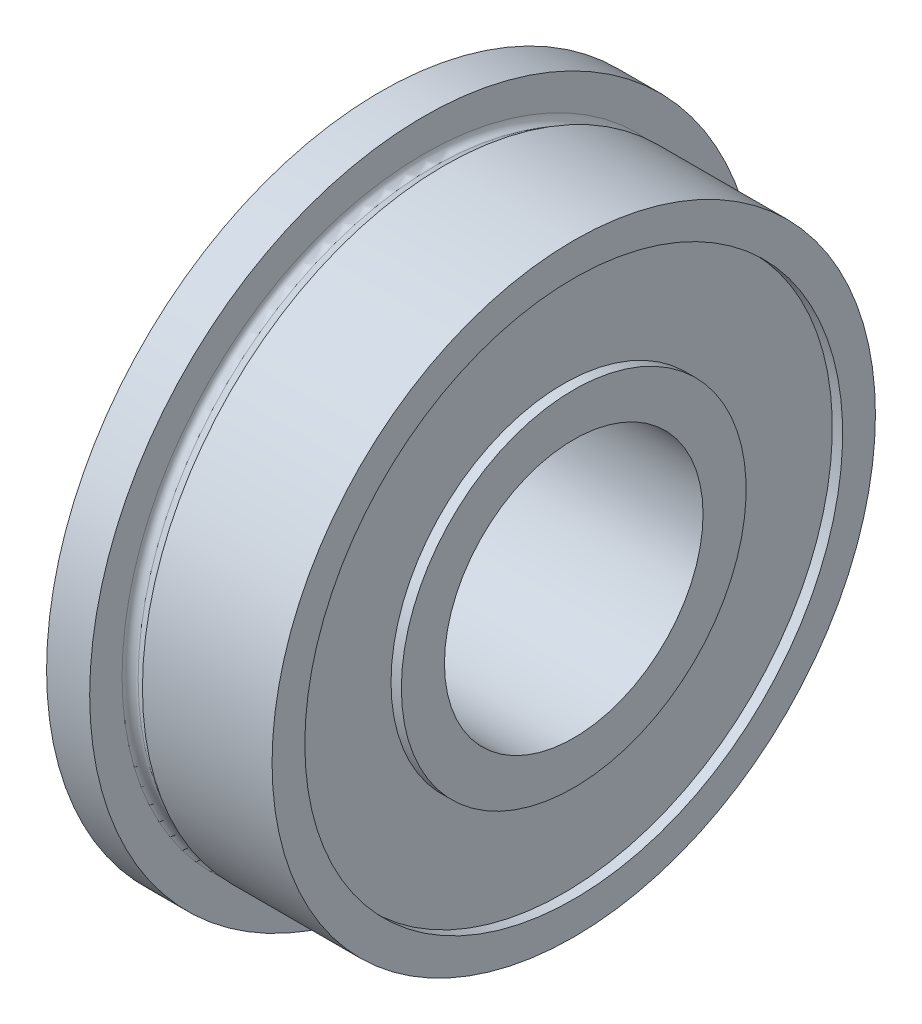
ISO-10303-21;
HEADER;
FILE_DESCRIPTION(('STEP AP214'),'2;1');
FILE_NAME('part.step','',(''),(''),'','','');
FILE_SCHEMA(('AUTOMOTIVE_DESIGN { 1 0 10303 214 1 1 1 1 }'));
ENDSEC;
DATA;
#1=APPLICATION_CONTEXT('core data for automotive mechanical design processes');
#2=APPLICATION_PROTOCOL_DEFINITION('international standard','automotive_design',2000,#1);
#3=PRODUCT_CONTEXT('',#1,'mechanical');
#4=PRODUCT('Part','Part','',(#3));
#5=PRODUCT_RELATED_PRODUCT_CATEGORY('part','',(#4));
#6=PRODUCT_DEFINITION_FORMATION('','',#4);
#7=PRODUCT_DEFINITION_CONTEXT('part definition',#1,'design');
#8=PRODUCT_DEFINITION('design','',#6,#7);
#9=PRODUCT_DEFINITION_SHAPE('','',#8);
#10=(LENGTH_UNIT() NAMED_UNIT(*) SI_UNIT(.MILLI.,.METRE.));
#11=(NAMED_UNIT(*) PLANE_ANGLE_UNIT() SI_UNIT($,.RADIAN.));
#12=(NAMED_UNIT(*) SI_UNIT($,.STERADIAN.) SOLID_ANGLE_UNIT());
#13=UNCERTAINTY_MEASURE_WITH_UNIT(LENGTH_MEASURE(1.E-05),#10,'distance_accuracy_value','');
#14=(GEOMETRIC_REPRESENTATION_CONTEXT(3) GLOBAL_UNCERTAINTY_ASSIGNED_CONTEXT((#13)) GLOBAL_UNIT_ASSIGNED_CONTEXT((#10,
#11,#12)) REPRESENTATION_CONTEXT('',''));
#15=CARTESIAN_POINT('',(0.,0.,0.));
#16=DIRECTION('',(0.,0.,1.));
#17=DIRECTION('',(1.,0.,0.));
#18=AXIS2_PLACEMENT_3D('',#15,#16,#17);
#19=CARTESIAN_POINT('',(7.112,9.906,0.));
#20=DIRECTION('',(-1.,0.,0.));
#21=DIRECTION('',(0.,0.,1.));
#22=AXIS2_PLACEMENT_3D('',#19,#20,#21);
#23=PLANE('',#22);
#24=CARTESIAN_POINT('',(7.112,0.,0.));
#25=DIRECTION('',(-1.,0.,0.));
#26=DIRECTION('',(0.,0.,1.));
#27=AXIS2_PLACEMENT_3D('',#24,#25,#26);
#28=CIRCLE('',#27,9.906);
#29=CARTESIAN_POINT('',(7.112,0.,9.906));
#30=VERTEX_POINT('',#29);
#31=EDGE_CURVE('E185',#30,#30,#28,.T.);
#32=ORIENTED_EDGE('',*,*,#31,.T.);
#33=EDGE_LOOP('',(#32));
#34=FACE_BOUND('',#33,.T.);
#35=CARTESIAN_POINT('',(7.112,0.,0.));
#36=DIRECTION('',(-1.,0.,0.));
#37=DIRECTION('',(0.,0.,1.));
#38=AXIS2_PLACEMENT_3D('',#35,#36,#37);
#39=CIRCLE('',#38,11.1125);
#40=CARTESIAN_POINT('',(7.112,0.,11.1125));
#41=VERTEX_POINT('',#40);
#42=EDGE_CURVE('E189',#41,#41,#39,.T.);
#43=ORIENTED_EDGE('',*,*,#42,.F.);
#44=EDGE_LOOP('',(#43));
#45=FACE_BOUND('',#44,.T.);
#46=ADVANCED_FACE('F25',(#34,#45),#23,.F.);
#47=CARTESIAN_POINT('',(0.,0.,0.));
#48=DIRECTION('',(-1.,0.,0.));
#49=DIRECTION('',(0.,0.,1.));
#50=AXIS2_PLACEMENT_3D('',#47,#48,#49);
#51=CYLINDRICAL_SURFACE('',#50,11.1125);
#52=CARTESIAN_POINT('',(2.3375,0.,0.));
#53=DIRECTION('',(1.,0.,0.));
#54=DIRECTION('',(0.,0.,-1.));
#55=AXIS2_PLACEMENT_3D('',#52,#53,#54);
#56=CIRCLE('',#55,11.1125);
#57=CARTESIAN_POINT('',(2.3375,0.,-11.1125));
#58=VERTEX_POINT('',#57);
#59=EDGE_CURVE('E184',#58,#58,#56,.F.);
#60=ORIENTED_EDGE('',*,*,#59,.F.);
#61=EDGE_LOOP('',(#60));
#62=FACE_BOUND('',#61,.T.);
#63=ORIENTED_EDGE('',*,*,#42,.T.);
#64=EDGE_LOOP('',(#63));
#65=FACE_BOUND('',#64,.T.);
#66=ADVANCED_FACE('F97',(#62,#65),#51,.T.);
#67=CARTESIAN_POINT('',(0.,0.,0.));
#68=DIRECTION('',(-1.,0.,0.));
#69=DIRECTION('',(0.,0.,1.));
#70=AXIS2_PLACEMENT_3D('',#67,#68,#69);
#71=CYLINDRICAL_SURFACE('',#70,9.906);
#72=ORIENTED_EDGE('',*,*,#31,.F.);
#73=EDGE_LOOP('',(#72));
#74=FACE_BOUND('',#73,.T.);
#75=CARTESIAN_POINT('',(6.731,0.,0.));
#76=DIRECTION('',(-1.,0.,0.));
#77=DIRECTION('',(0.,0.,1.));
#78=AXIS2_PLACEMENT_3D('',#75,#76,#77);
#79=CIRCLE('',#78,9.906);
#80=CARTESIAN_POINT('',(6.731,0.,9.906));
#81=VERTEX_POINT('',#80);
#82=EDGE_CURVE('E180',#81,#81,#79,.T.);
#83=ORIENTED_EDGE('',*,*,#82,.T.);
#84=EDGE_LOOP('',(#83));
#85=FACE_BOUND('',#84,.T.);
#86=ADVANCED_FACE('F94',(#74,#85),#71,.F.);
#87=CARTESIAN_POINT('',(2.3375,0.,0.));
#88=DIRECTION('',(1.,0.,0.));
#89=DIRECTION('',(0.,0.,-1.));
#90=AXIS2_PLACEMENT_3D('',#87,#88,#89);
#91=CONICAL_SURFACE('',#90,11.1125,0.523598775598302);
#92=ORIENTED_EDGE('',*,*,#59,.T.);
#93=EDGE_LOOP('',(#92));
#94=FACE_BOUND('',#93,.T.);
#95=CARTESIAN_POINT('',(1.9625,0.,0.));
#96=DIRECTION('',(-1.,0.,0.));
#97=DIRECTION('',(0.,0.,1.));
#98=AXIS2_PLACEMENT_3D('',#95,#96,#97);
#99=CIRCLE('',#98,10.8959936490539);
#100=CARTESIAN_POINT('',(1.9625,0.,10.8959936490539));
#101=VERTEX_POINT('',#100);
#102=EDGE_CURVE('E68',#101,#101,#99,.F.);
#103=ORIENTED_EDGE('',*,*,#102,.T.);
#104=EDGE_LOOP('',(#103));
#105=FACE_BOUND('',#104,.T.);
#106=ADVANCED_FACE('F90',(#94,#105),#91,.T.);
#107=CARTESIAN_POINT('',(6.731,9.906,0.));
#108=DIRECTION('',(-1.,0.,0.));
#109=DIRECTION('',(0.,0.,1.));
#110=AXIS2_PLACEMENT_3D('',#107,#108,#109);
#111=PLANE('',#110);
#112=CARTESIAN_POINT('',(6.731,0.,0.));
#113=DIRECTION('',(-1.,0.,0.));
#114=DIRECTION('',(0.,0.,1.));
#115=AXIS2_PLACEMENT_3D('',#112,#113,#114);
#116=CIRCLE('',#115,6.35);
#117=CARTESIAN_POINT('',(6.731,0.,6.35));
#118=VERTEX_POINT('',#117);
#119=EDGE_CURVE('E170',#118,#118,#116,.F.);
#120=ORIENTED_EDGE('',*,*,#119,.F.);
#121=EDGE_LOOP('',(#120));
#122=FACE_BOUND('',#121,.T.);
#123=ORIENTED_EDGE('',*,*,#82,.F.);
#124=EDGE_LOOP('',(#123));
#125=FACE_BOUND('',#124,.T.);
#126=ADVANCED_FACE('F86',(#122,#125),#111,.F.);
#127=CARTESIAN_POINT('',(0.,0.,0.));
#128=DIRECTION('',(-1.,0.,0.));
#129=DIRECTION('',(0.,0.,1.));
#130=AXIS2_PLACEMENT_3D('',#127,#128,#129);
#131=CYLINDRICAL_SURFACE('',#130,6.35);
#132=ORIENTED_EDGE('',*,*,#119,.T.);
#133=EDGE_LOOP('',(#132));
#134=FACE_BOUND('',#133,.T.);
#135=CARTESIAN_POINT('',(7.112,0.,0.));
#136=DIRECTION('',(-1.,0.,0.));
#137=DIRECTION('',(0.,0.,1.));
#138=AXIS2_PLACEMENT_3D('',#135,#136,#137);
#139=CIRCLE('',#138,6.35);
#140=CARTESIAN_POINT('',(7.112,0.,6.35));
#141=VERTEX_POINT('',#140);
#142=EDGE_CURVE('E55',#141,#141,#139,.T.);
#143=ORIENTED_EDGE('',*,*,#142,.T.);
#144=EDGE_LOOP('',(#143));
#145=FACE_BOUND('',#144,.T.);
#146=ADVANCED_FACE('F80',(#134,#145),#131,.T.);
#147=CARTESIAN_POINT('',(1.8375,0.,0.));
#148=DIRECTION('',(-1.,0.,0.));
#149=DIRECTION('',(0.,0.,1.));
#150=AXIS2_PLACEMENT_3D('',#147,#148,#149);
#151=TOROIDAL_SURFACE('',#150,11.1125,0.250000000000001);
#152=ORIENTED_EDGE('',*,*,#102,.F.);
#153=EDGE_LOOP('',(#152));
#154=FACE_BOUND('',#153,.T.);
#155=CARTESIAN_POINT('',(1.5875,0.,0.));
#156=DIRECTION('',(1.,0.,0.));
#157=DIRECTION('',(0.,0.,1.));
#158=AXIS2_PLACEMENT_3D('',#155,#156,#157);
#159=CIRCLE('',#158,11.1125);
#160=CARTESIAN_POINT('',(1.5875,0.,11.1125));
#161=VERTEX_POINT('',#160);
#162=CARTESIAN_POINT('',(1.5875,0.,-11.1125));
#163=VERTEX_POINT('',#162);
#164=EDGE_CURVE('E49',#161,#163,#159,.T.);
#165=ORIENTED_EDGE('',*,*,#164,.T.);
#166=CARTESIAN_POINT('',(1.5875,0.,0.));
#167=DIRECTION('',(1.,0.,0.));
#168=DIRECTION('',(0.,0.,-1.));
#169=AXIS2_PLACEMENT_3D('',#166,#167,#168);
#170=CIRCLE('',#169,11.1125);
#171=EDGE_CURVE('E46',#163,#161,#170,.T.);
#172=ORIENTED_EDGE('',*,*,#171,.T.);
#173=EDGE_LOOP('',(#165,#172));
#174=FACE_BOUND('',#173,.T.);
#175=ADVANCED_FACE('F58',(#154,#174),#151,.F.);
#176=CARTESIAN_POINT('',(7.112,4.7625,0.));
#177=DIRECTION('',(-1.,0.,0.));
#178=DIRECTION('',(0.,0.,1.));
#179=AXIS2_PLACEMENT_3D('',#176,#177,#178);
#180=PLANE('',#179);
#181=CARTESIAN_POINT('',(7.112,0.,0.));
#182=DIRECTION('',(-1.,0.,0.));
#183=DIRECTION('',(0.,0.,1.));
#184=AXIS2_PLACEMENT_3D('',#181,#182,#183);
#185=CIRCLE('',#184,4.7625);
#186=CARTESIAN_POINT('',(7.112,0.,4.7625));
#187=VERTEX_POINT('',#186);
#188=EDGE_CURVE('E60',#187,#187,#185,.T.);
#189=ORIENTED_EDGE('',*,*,#188,.T.);
#190=EDGE_LOOP('',(#189));
#191=FACE_BOUND('',#190,.T.);
#192=ORIENTED_EDGE('',*,*,#142,.F.);
#193=EDGE_LOOP('',(#192));
#194=FACE_BOUND('',#193,.T.);
#195=ADVANCED_FACE('F79',(#191,#194),#180,.F.);
#196=CARTESIAN_POINT('',(1.5875,11.1125,0.));
#197=DIRECTION('',(-1.,0.,0.));
#198=DIRECTION('',(0.,0.,1.));
#199=AXIS2_PLACEMENT_3D('',#196,#197,#198);
#200=PLANE('',#199);
#201=ORIENTED_EDGE('',*,*,#164,.F.);
#202=ORIENTED_EDGE('',*,*,#171,.F.);
#203=EDGE_LOOP('',(#201,#202));
#204=FACE_BOUND('',#203,.T.);
#205=CARTESIAN_POINT('',(1.5875,0.,0.));
#206=DIRECTION('',(-1.,0.,0.));
#207=DIRECTION('',(0.,0.,1.));
#208=AXIS2_PLACEMENT_3D('',#205,#206,#207);
#209=CIRCLE('',#208,12.3063);
#210=CARTESIAN_POINT('',(1.5875,0.,12.3063));
#211=VERTEX_POINT('',#210);
#212=EDGE_CURVE('E197',#211,#211,#209,.T.);
#213=ORIENTED_EDGE('',*,*,#212,.F.);
#214=EDGE_LOOP('',(#213));
#215=FACE_BOUND('',#214,.T.);
#216=ADVANCED_FACE('F51',(#204,#215),#200,.F.);
#217=CARTESIAN_POINT('',(0.,0.,0.));
#218=DIRECTION('',(-1.,0.,0.));
#219=DIRECTION('',(0.,0.,1.));
#220=AXIS2_PLACEMENT_3D('',#217,#218,#219);
#221=CYLINDRICAL_SURFACE('',#220,4.7625);
#222=ORIENTED_EDGE('',*,*,#188,.F.);
#223=EDGE_LOOP('',(#222));
#224=FACE_BOUND('',#223,.T.);
#225=CARTESIAN_POINT('',(0.,0.,0.));
#226=DIRECTION('',(-1.,0.,0.));
#227=DIRECTION('',(0.,0.,1.));
#228=AXIS2_PLACEMENT_3D('',#225,#226,#227);
#229=CIRCLE('',#228,4.7625);
#230=CARTESIAN_POINT('',(0.,0.,4.7625));
#231=VERTEX_POINT('',#230);
#232=EDGE_CURVE('E200',#231,#231,#229,.T.);
#233=ORIENTED_EDGE('',*,*,#232,.T.);
#234=EDGE_LOOP('',(#233));
#235=FACE_BOUND('',#234,.T.);
#236=ADVANCED_FACE('F136',(#224,#235),#221,.F.);
#237=CARTESIAN_POINT('',(0.,0.,0.));
#238=DIRECTION('',(-1.,0.,0.));
#239=DIRECTION('',(0.,0.,1.));
#240=AXIS2_PLACEMENT_3D('',#237,#238,#239);
#241=CYLINDRICAL_SURFACE('',#240,12.3063);
#242=CARTESIAN_POINT('',(0.,0.,0.));
#243=DIRECTION('',(-1.,0.,0.));
#244=DIRECTION('',(0.,0.,1.));
#245=AXIS2_PLACEMENT_3D('',#242,#243,#244);
#246=CIRCLE('',#245,12.3063);
#247=CARTESIAN_POINT('',(0.,0.,12.3063));
#248=VERTEX_POINT('',#247);
#249=EDGE_CURVE('E214',#248,#248,#246,.F.);
#250=ORIENTED_EDGE('',*,*,#249,.T.);
#251=EDGE_LOOP('',(#250));
#252=FACE_BOUND('',#251,.T.);
#253=ORIENTED_EDGE('',*,*,#212,.T.);
#254=EDGE_LOOP('',(#253));
#255=FACE_BOUND('',#254,.T.);
#256=ADVANCED_FACE('F132',(#252,#255),#241,.T.);
#257=CARTESIAN_POINT('',(0.,6.35,0.));
#258=DIRECTION('',(1.,0.,0.));
#259=DIRECTION('',(0.,0.,-1.));
#260=AXIS2_PLACEMENT_3D('',#257,#258,#259);
#261=PLANE('',#260);
#262=CARTESIAN_POINT('',(0.,0.,0.));
#263=DIRECTION('',(-1.,0.,0.));
#264=DIRECTION('',(0.,0.,1.));
#265=AXIS2_PLACEMENT_3D('',#262,#263,#264);
#266=CIRCLE('',#265,6.35);
#267=CARTESIAN_POINT('',(0.,0.,6.35));
#268=VERTEX_POINT('',#267);
#269=EDGE_CURVE('E210',#268,#268,#266,.F.);
#270=ORIENTED_EDGE('',*,*,#269,.F.);
#271=EDGE_LOOP('',(#270));
#272=FACE_BOUND('',#271,.T.);
#273=ORIENTED_EDGE('',*,*,#232,.F.);
#274=EDGE_LOOP('',(#273));
#275=FACE_BOUND('',#274,.T.);
#276=ADVANCED_FACE('F128',(#272,#275),#261,.F.);
#277=CARTESIAN_POINT('',(0.,12.3063,0.));
#278=DIRECTION('',(1.,0.,0.));
#279=DIRECTION('',(0.,0.,-1.));
#280=AXIS2_PLACEMENT_3D('',#277,#278,#279);
#281=PLANE('',#280);
#282=ORIENTED_EDGE('',*,*,#249,.F.);
#283=EDGE_LOOP('',(#282));
#284=FACE_BOUND('',#283,.T.);
#285=CARTESIAN_POINT('',(0.,0.,0.));
#286=DIRECTION('',(-1.,0.,0.));
#287=DIRECTION('',(0.,0.,1.));
#288=AXIS2_PLACEMENT_3D('',#285,#286,#287);
#289=CIRCLE('',#288,9.906);
#290=CARTESIAN_POINT('',(0.,0.,9.906));
#291=VERTEX_POINT('',#290);
#292=EDGE_CURVE('E206',#291,#291,#289,.F.);
#293=ORIENTED_EDGE('',*,*,#292,.T.);
#294=EDGE_LOOP('',(#293));
#295=FACE_BOUND('',#294,.T.);
#296=ADVANCED_FACE('F124',(#284,#295),#281,.F.);
#297=CARTESIAN_POINT('',(0.,0.,0.));
#298=DIRECTION('',(-1.,0.,0.));
#299=DIRECTION('',(0.,0.,1.));
#300=AXIS2_PLACEMENT_3D('',#297,#298,#299);
#301=CYLINDRICAL_SURFACE('',#300,6.35);
#302=ORIENTED_EDGE('',*,*,#269,.T.);
#303=EDGE_LOOP('',(#302));
#304=FACE_BOUND('',#303,.T.);
#305=CARTESIAN_POINT('',(0.381,0.,0.));
#306=DIRECTION('',(-1.,0.,0.));
#307=DIRECTION('',(0.,0.,1.));
#308=AXIS2_PLACEMENT_3D('',#305,#306,#307);
#309=CIRCLE('',#308,6.35);
#310=CARTESIAN_POINT('',(0.381,0.,6.35));
#311=VERTEX_POINT('',#310);
#312=EDGE_CURVE('E36',#311,#311,#309,.T.);
#313=ORIENTED_EDGE('',*,*,#312,.T.);
#314=EDGE_LOOP('',(#313));
#315=FACE_BOUND('',#314,.T.);
#316=ADVANCED_FACE('F116',(#304,#315),#301,.T.);
#317=CARTESIAN_POINT('',(0.,0.,0.));
#318=DIRECTION('',(-1.,0.,0.));
#319=DIRECTION('',(0.,0.,1.));
#320=AXIS2_PLACEMENT_3D('',#317,#318,#319);
#321=CYLINDRICAL_SURFACE('',#320,9.906);
#322=CARTESIAN_POINT('',(0.381,0.,0.));
#323=DIRECTION('',(-1.,0.,0.));
#324=DIRECTION('',(0.,0.,1.));
#325=AXIS2_PLACEMENT_3D('',#322,#323,#324);
#326=CIRCLE('',#325,9.906);
#327=CARTESIAN_POINT('',(0.381,0.,9.906));
#328=VERTEX_POINT('',#327);
#329=EDGE_CURVE('E13',#328,#328,#326,.F.);
#330=ORIENTED_EDGE('',*,*,#329,.T.);
#331=EDGE_LOOP('',(#330));
#332=FACE_BOUND('',#331,.T.);
#333=ORIENTED_EDGE('',*,*,#292,.F.);
#334=EDGE_LOOP('',(#333));
#335=FACE_BOUND('',#334,.T.);
#336=ADVANCED_FACE('F110',(#332,#335),#321,.F.);
#337=CARTESIAN_POINT('',(0.381,9.906,0.));
#338=DIRECTION('',(1.,0.,0.));
#339=DIRECTION('',(0.,0.,-1.));
#340=AXIS2_PLACEMENT_3D('',#337,#338,#339);
#341=PLANE('',#340);
#342=ORIENTED_EDGE('',*,*,#329,.F.);
#343=EDGE_LOOP('',(#342));
#344=FACE_BOUND('',#343,.T.);
#345=ORIENTED_EDGE('',*,*,#312,.F.);
#346=EDGE_LOOP('',(#345));
#347=FACE_BOUND('',#346,.T.);
#348=ADVANCED_FACE('F108',(#344,#347),#341,.F.);
#349=CLOSED_SHELL('',(#46,#66,#86,#106,#126,#146,#175,#195,#216,#236,#256,#276,#296,#316,#336,#348));
#350=MANIFOLD_SOLID_BREP('B1',#349);
#351=ADVANCED_BREP_SHAPE_REPRESENTATION('',(#18,#350),#14);
#352=SHAPE_DEFINITION_REPRESENTATION(#9,#351);
ENDSEC;
END-ISO-10303-21;
